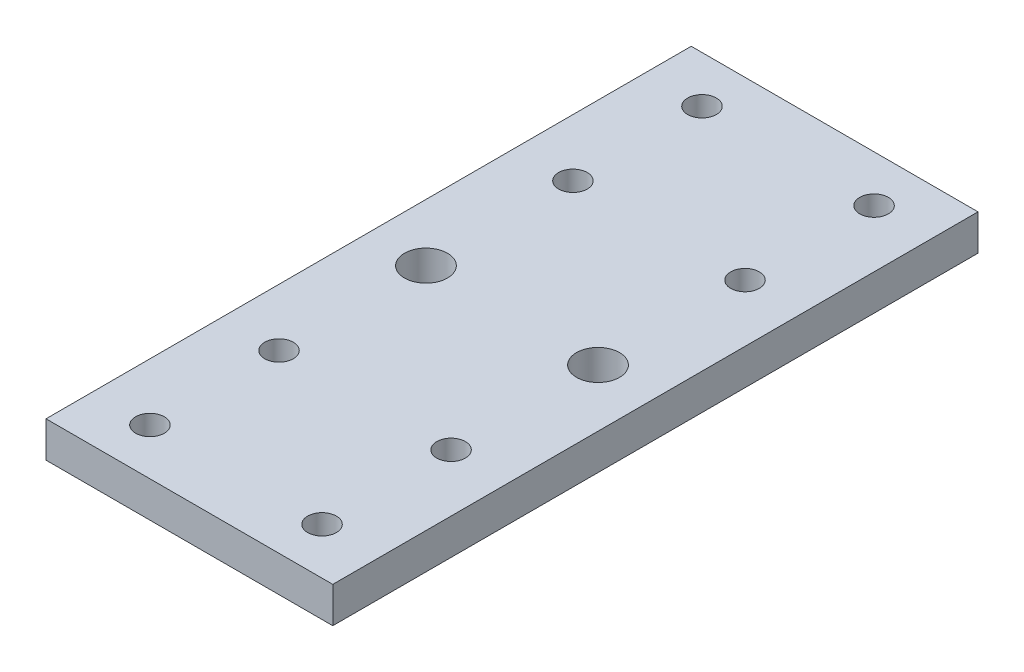
ISO-10303-21;
HEADER;
FILE_DESCRIPTION(('STEP AP214'),'2;1');
FILE_NAME('part.step','',(''),(''),'','','');
FILE_SCHEMA(('AUTOMOTIVE_DESIGN { 1 0 10303 214 1 1 1 1 }'));
ENDSEC;
DATA;
#1=APPLICATION_CONTEXT('core data for automotive mechanical design processes');
#2=APPLICATION_PROTOCOL_DEFINITION('international standard','automotive_design',2000,#1);
#3=PRODUCT_CONTEXT('',#1,'mechanical');
#4=PRODUCT('Part','Part','',(#3));
#5=PRODUCT_RELATED_PRODUCT_CATEGORY('part','',(#4));
#6=PRODUCT_DEFINITION_FORMATION('','',#4);
#7=PRODUCT_DEFINITION_CONTEXT('part definition',#1,'design');
#8=PRODUCT_DEFINITION('design','',#6,#7);
#9=PRODUCT_DEFINITION_SHAPE('','',#8);
#10=(LENGTH_UNIT() NAMED_UNIT(*) SI_UNIT(.MILLI.,.METRE.));
#11=(NAMED_UNIT(*) PLANE_ANGLE_UNIT() SI_UNIT($,.RADIAN.));
#12=(NAMED_UNIT(*) SI_UNIT($,.STERADIAN.) SOLID_ANGLE_UNIT());
#13=UNCERTAINTY_MEASURE_WITH_UNIT(LENGTH_MEASURE(1.E-05),#10,'distance_accuracy_value','');
#14=(GEOMETRIC_REPRESENTATION_CONTEXT(3) GLOBAL_UNCERTAINTY_ASSIGNED_CONTEXT((#13)) GLOBAL_UNIT_ASSIGNED_CONTEXT((#10,
#11,#12)) REPRESENTATION_CONTEXT('',''));
#15=CARTESIAN_POINT('',(0.,0.,0.));
#16=DIRECTION('',(0.,0.,1.));
#17=DIRECTION('',(1.,0.,0.));
#18=AXIS2_PLACEMENT_3D('',#15,#16,#17);
#19=CARTESIAN_POINT('',(0.,5.,0.));
#20=DIRECTION('',(0.,-1.,0.));
#21=DIRECTION('',(0.,0.,-1.));
#22=AXIS2_PLACEMENT_3D('',#19,#20,#21);
#23=PLANE('',#22);
#24=DIRECTION('',(0.,0.,-1.));
#25=VECTOR('',#24,1.);
#26=CARTESIAN_POINT('',(20.,5.,45.0000000000001));
#27=LINE('',#26,#25);
#28=CARTESIAN_POINT('',(20.,5.,45.0000000000001));
#29=VERTEX_POINT('',#28);
#30=CARTESIAN_POINT('',(20.,5.,-44.9999999999999));
#31=VERTEX_POINT('',#30);
#32=EDGE_CURVE('E85',#29,#31,#27,.T.);
#33=ORIENTED_EDGE('',*,*,#32,.T.);
#34=DIRECTION('',(-1.,0.,0.));
#35=VECTOR('',#34,1.);
#36=CARTESIAN_POINT('',(-20.,5.,-44.9999999999999));
#37=LINE('',#36,#35);
#38=CARTESIAN_POINT('',(-20.,5.,-44.9999999999999));
#39=VERTEX_POINT('',#38);
#40=EDGE_CURVE('E80',#31,#39,#37,.T.);
#41=ORIENTED_EDGE('',*,*,#40,.T.);
#42=DIRECTION('',(0.,0.,1.));
#43=VECTOR('',#42,1.);
#44=CARTESIAN_POINT('',(-20.,5.,45.0000000000001));
#45=LINE('',#44,#43);
#46=CARTESIAN_POINT('',(-20.,5.,45.0000000000001));
#47=VERTEX_POINT('',#46);
#48=EDGE_CURVE('E83',#39,#47,#45,.T.);
#49=ORIENTED_EDGE('',*,*,#48,.T.);
#50=DIRECTION('',(1.,0.,0.));
#51=VECTOR('',#50,1.);
#52=CARTESIAN_POINT('',(-20.,5.,45.0000000000001));
#53=LINE('',#52,#51);
#54=EDGE_CURVE('E50',#47,#29,#53,.T.);
#55=ORIENTED_EDGE('',*,*,#54,.T.);
#56=EDGE_LOOP('',(#33,#41,#49,#55));
#57=FACE_BOUND('',#56,.T.);
#58=CARTESIAN_POINT('',(-12.,5.,38.5000000000001));
#59=DIRECTION('',(0.,1.,0.));
#60=DIRECTION('',(0.,0.,1.));
#61=AXIS2_PLACEMENT_3D('',#58,#59,#60);
#62=CIRCLE('',#61,2.);
#63=CARTESIAN_POINT('',(-12.,5.,40.5000000000001));
#64=VERTEX_POINT('',#63);
#65=EDGE_CURVE('E100',#64,#64,#62,.T.);
#66=ORIENTED_EDGE('',*,*,#65,.F.);
#67=EDGE_LOOP('',(#66));
#68=FACE_BOUND('',#67,.T.);
#69=CARTESIAN_POINT('',(-12.,5.,20.5000000000001));
#70=DIRECTION('',(0.,1.,0.));
#71=DIRECTION('',(0.,0.,1.));
#72=AXIS2_PLACEMENT_3D('',#69,#70,#71);
#73=CIRCLE('',#72,2.);
#74=CARTESIAN_POINT('',(-12.,5.,22.5000000000001));
#75=VERTEX_POINT('',#74);
#76=EDGE_CURVE('E115',#75,#75,#73,.T.);
#77=ORIENTED_EDGE('',*,*,#76,.F.);
#78=EDGE_LOOP('',(#77));
#79=FACE_BOUND('',#78,.T.);
#80=CARTESIAN_POINT('',(-12.,5.,-20.4999999999999));
#81=DIRECTION('',(0.,1.,0.));
#82=DIRECTION('',(0.,0.,1.));
#83=AXIS2_PLACEMENT_3D('',#80,#81,#82);
#84=CIRCLE('',#83,2.);
#85=CARTESIAN_POINT('',(-12.,5.,-18.4999999999999));
#86=VERTEX_POINT('',#85);
#87=EDGE_CURVE('E121',#86,#86,#84,.T.);
#88=ORIENTED_EDGE('',*,*,#87,.F.);
#89=EDGE_LOOP('',(#88));
#90=FACE_BOUND('',#89,.T.);
#91=CARTESIAN_POINT('',(-12.,5.,-38.4999999999999));
#92=DIRECTION('',(0.,1.,0.));
#93=DIRECTION('',(0.,0.,1.));
#94=AXIS2_PLACEMENT_3D('',#91,#92,#93);
#95=CIRCLE('',#94,2.);
#96=CARTESIAN_POINT('',(-12.,5.,-36.4999999999999));
#97=VERTEX_POINT('',#96);
#98=EDGE_CURVE('E127',#97,#97,#95,.T.);
#99=ORIENTED_EDGE('',*,*,#98,.F.);
#100=EDGE_LOOP('',(#99));
#101=FACE_BOUND('',#100,.T.);
#102=CARTESIAN_POINT('',(12.,5.,-38.4999999999999));
#103=DIRECTION('',(0.,1.,0.));
#104=DIRECTION('',(0.,0.,1.));
#105=AXIS2_PLACEMENT_3D('',#102,#103,#104);
#106=CIRCLE('',#105,2.);
#107=CARTESIAN_POINT('',(12.,5.,-36.4999999999999));
#108=VERTEX_POINT('',#107);
#109=EDGE_CURVE('E133',#108,#108,#106,.T.);
#110=ORIENTED_EDGE('',*,*,#109,.F.);
#111=EDGE_LOOP('',(#110));
#112=FACE_BOUND('',#111,.T.);
#113=CARTESIAN_POINT('',(12.,5.,-20.4999999999999));
#114=DIRECTION('',(0.,1.,0.));
#115=DIRECTION('',(0.,0.,1.));
#116=AXIS2_PLACEMENT_3D('',#113,#114,#115);
#117=CIRCLE('',#116,2.);
#118=CARTESIAN_POINT('',(12.,5.,-18.4999999999999));
#119=VERTEX_POINT('',#118);
#120=EDGE_CURVE('E139',#119,#119,#117,.T.);
#121=ORIENTED_EDGE('',*,*,#120,.F.);
#122=EDGE_LOOP('',(#121));
#123=FACE_BOUND('',#122,.T.);
#124=CARTESIAN_POINT('',(12.,5.,20.5000000000001));
#125=DIRECTION('',(0.,1.,0.));
#126=DIRECTION('',(0.,0.,1.));
#127=AXIS2_PLACEMENT_3D('',#124,#125,#126);
#128=CIRCLE('',#127,2.);
#129=CARTESIAN_POINT('',(12.,5.,22.5000000000001));
#130=VERTEX_POINT('',#129);
#131=EDGE_CURVE('E145',#130,#130,#128,.T.);
#132=ORIENTED_EDGE('',*,*,#131,.F.);
#133=EDGE_LOOP('',(#132));
#134=FACE_BOUND('',#133,.T.);
#135=CARTESIAN_POINT('',(12.,5.,38.5000000000001));
#136=DIRECTION('',(0.,1.,0.));
#137=DIRECTION('',(0.,0.,1.));
#138=AXIS2_PLACEMENT_3D('',#135,#136,#137);
#139=CIRCLE('',#138,2.);
#140=CARTESIAN_POINT('',(12.,5.,40.5000000000001));
#141=VERTEX_POINT('',#140);
#142=EDGE_CURVE('E151',#141,#141,#139,.T.);
#143=ORIENTED_EDGE('',*,*,#142,.F.);
#144=EDGE_LOOP('',(#143));
#145=FACE_BOUND('',#144,.T.);
#146=CARTESIAN_POINT('',(-12.,5.,1.2490009027033E-13));
#147=DIRECTION('',(0.,1.,0.));
#148=DIRECTION('',(0.,0.,1.));
#149=AXIS2_PLACEMENT_3D('',#146,#147,#148);
#150=CIRCLE('',#149,3.);
#151=CARTESIAN_POINT('',(-12.,5.,3.00000000000012));
#152=VERTEX_POINT('',#151);
#153=EDGE_CURVE('E157',#152,#152,#150,.T.);
#154=ORIENTED_EDGE('',*,*,#153,.F.);
#155=EDGE_LOOP('',(#154));
#156=FACE_BOUND('',#155,.T.);
#157=CARTESIAN_POINT('',(12.,5.,1.2490009027033E-13));
#158=DIRECTION('',(0.,1.,0.));
#159=DIRECTION('',(0.,0.,-1.));
#160=AXIS2_PLACEMENT_3D('',#157,#158,#159);
#161=CIRCLE('',#160,3.);
#162=CARTESIAN_POINT('',(12.,5.,-2.99999999999987));
#163=VERTEX_POINT('',#162);
#164=EDGE_CURVE('E163',#163,#163,#161,.T.);
#165=ORIENTED_EDGE('',*,*,#164,.F.);
#166=EDGE_LOOP('',(#165));
#167=FACE_BOUND('',#166,.T.);
#168=ADVANCED_FACE('F33',(#57,#68,#79,#90,#101,#112,#123,#134,#145,#156,#167),#23,.F.);
#169=CARTESIAN_POINT('',(0.,0.,0.));
#170=DIRECTION('',(0.,-1.,0.));
#171=DIRECTION('',(0.,0.,-1.));
#172=AXIS2_PLACEMENT_3D('',#169,#170,#171);
#173=PLANE('',#172);
#174=CARTESIAN_POINT('',(-12.,0.,1.2490009027033E-13));
#175=DIRECTION('',(0.,1.,0.));
#176=DIRECTION('',(0.,0.,1.));
#177=AXIS2_PLACEMENT_3D('',#174,#175,#176);
#178=CIRCLE('',#177,3.);
#179=CARTESIAN_POINT('',(-12.,0.,3.00000000000012));
#180=VERTEX_POINT('',#179);
#181=EDGE_CURVE('E160',#180,#180,#178,.T.);
#182=ORIENTED_EDGE('',*,*,#181,.T.);
#183=EDGE_LOOP('',(#182));
#184=FACE_BOUND('',#183,.T.);
#185=CARTESIAN_POINT('',(12.,0.,20.5000000000001));
#186=DIRECTION('',(0.,1.,0.));
#187=DIRECTION('',(0.,0.,1.));
#188=AXIS2_PLACEMENT_3D('',#185,#186,#187);
#189=CIRCLE('',#188,2.);
#190=CARTESIAN_POINT('',(12.,0.,22.5000000000001));
#191=VERTEX_POINT('',#190);
#192=EDGE_CURVE('E148',#191,#191,#189,.T.);
#193=ORIENTED_EDGE('',*,*,#192,.T.);
#194=EDGE_LOOP('',(#193));
#195=FACE_BOUND('',#194,.T.);
#196=CARTESIAN_POINT('',(12.,0.,-38.4999999999999));
#197=DIRECTION('',(0.,1.,0.));
#198=DIRECTION('',(0.,0.,1.));
#199=AXIS2_PLACEMENT_3D('',#196,#197,#198);
#200=CIRCLE('',#199,2.);
#201=CARTESIAN_POINT('',(12.,0.,-36.4999999999999));
#202=VERTEX_POINT('',#201);
#203=EDGE_CURVE('E136',#202,#202,#200,.T.);
#204=ORIENTED_EDGE('',*,*,#203,.T.);
#205=EDGE_LOOP('',(#204));
#206=FACE_BOUND('',#205,.T.);
#207=CARTESIAN_POINT('',(-12.,0.,-20.4999999999999));
#208=DIRECTION('',(0.,1.,0.));
#209=DIRECTION('',(0.,0.,1.));
#210=AXIS2_PLACEMENT_3D('',#207,#208,#209);
#211=CIRCLE('',#210,2.);
#212=CARTESIAN_POINT('',(-12.,0.,-18.4999999999999));
#213=VERTEX_POINT('',#212);
#214=EDGE_CURVE('E124',#213,#213,#211,.T.);
#215=ORIENTED_EDGE('',*,*,#214,.T.);
#216=EDGE_LOOP('',(#215));
#217=FACE_BOUND('',#216,.T.);
#218=CARTESIAN_POINT('',(-12.,0.,38.5000000000001));
#219=DIRECTION('',(0.,1.,0.));
#220=DIRECTION('',(0.,0.,1.));
#221=AXIS2_PLACEMENT_3D('',#218,#219,#220);
#222=CIRCLE('',#221,2.);
#223=CARTESIAN_POINT('',(-12.,0.,40.5000000000001));
#224=VERTEX_POINT('',#223);
#225=EDGE_CURVE('E112',#224,#224,#222,.T.);
#226=ORIENTED_EDGE('',*,*,#225,.T.);
#227=EDGE_LOOP('',(#226));
#228=FACE_BOUND('',#227,.T.);
#229=DIRECTION('',(0.,0.,-1.));
#230=VECTOR('',#229,1.);
#231=CARTESIAN_POINT('',(20.,0.,45.0000000000001));
#232=LINE('',#231,#230);
#233=CARTESIAN_POINT('',(20.,0.,45.0000000000001));
#234=VERTEX_POINT('',#233);
#235=CARTESIAN_POINT('',(20.,0.,-44.9999999999999));
#236=VERTEX_POINT('',#235);
#237=EDGE_CURVE('E97',#234,#236,#232,.T.);
#238=ORIENTED_EDGE('',*,*,#237,.F.);
#239=DIRECTION('',(1.,0.,0.));
#240=VECTOR('',#239,1.);
#241=CARTESIAN_POINT('',(-20.,0.,45.0000000000001));
#242=LINE('',#241,#240);
#243=CARTESIAN_POINT('',(-20.,0.,45.0000000000001));
#244=VERTEX_POINT('',#243);
#245=EDGE_CURVE('E73',#244,#234,#242,.T.);
#246=ORIENTED_EDGE('',*,*,#245,.F.);
#247=DIRECTION('',(0.,0.,1.));
#248=VECTOR('',#247,1.);
#249=CARTESIAN_POINT('',(-20.,0.,45.0000000000001));
#250=LINE('',#249,#248);
#251=CARTESIAN_POINT('',(-20.,0.,-44.9999999999999));
#252=VERTEX_POINT('',#251);
#253=EDGE_CURVE('E67',#252,#244,#250,.T.);
#254=ORIENTED_EDGE('',*,*,#253,.F.);
#255=DIRECTION('',(-1.,0.,0.));
#256=VECTOR('',#255,1.);
#257=CARTESIAN_POINT('',(-20.,0.,-44.9999999999999));
#258=LINE('',#257,#256);
#259=EDGE_CURVE('E89',#236,#252,#258,.T.);
#260=ORIENTED_EDGE('',*,*,#259,.F.);
#261=EDGE_LOOP('',(#238,#246,#254,#260));
#262=FACE_BOUND('',#261,.T.);
#263=CARTESIAN_POINT('',(-12.,0.,20.5000000000001));
#264=DIRECTION('',(0.,1.,0.));
#265=DIRECTION('',(0.,0.,1.));
#266=AXIS2_PLACEMENT_3D('',#263,#264,#265);
#267=CIRCLE('',#266,2.);
#268=CARTESIAN_POINT('',(-12.,0.,22.5000000000001));
#269=VERTEX_POINT('',#268);
#270=EDGE_CURVE('E118',#269,#269,#267,.T.);
#271=ORIENTED_EDGE('',*,*,#270,.T.);
#272=EDGE_LOOP('',(#271));
#273=FACE_BOUND('',#272,.T.);
#274=CARTESIAN_POINT('',(-12.,0.,-38.4999999999999));
#275=DIRECTION('',(0.,1.,0.));
#276=DIRECTION('',(0.,0.,1.));
#277=AXIS2_PLACEMENT_3D('',#274,#275,#276);
#278=CIRCLE('',#277,2.);
#279=CARTESIAN_POINT('',(-12.,0.,-36.4999999999999));
#280=VERTEX_POINT('',#279);
#281=EDGE_CURVE('E130',#280,#280,#278,.T.);
#282=ORIENTED_EDGE('',*,*,#281,.T.);
#283=EDGE_LOOP('',(#282));
#284=FACE_BOUND('',#283,.T.);
#285=CARTESIAN_POINT('',(12.,0.,-20.4999999999999));
#286=DIRECTION('',(0.,1.,0.));
#287=DIRECTION('',(0.,0.,1.));
#288=AXIS2_PLACEMENT_3D('',#285,#286,#287);
#289=CIRCLE('',#288,2.);
#290=CARTESIAN_POINT('',(12.,0.,-18.4999999999999));
#291=VERTEX_POINT('',#290);
#292=EDGE_CURVE('E142',#291,#291,#289,.T.);
#293=ORIENTED_EDGE('',*,*,#292,.T.);
#294=EDGE_LOOP('',(#293));
#295=FACE_BOUND('',#294,.T.);
#296=CARTESIAN_POINT('',(12.,0.,38.5000000000001));
#297=DIRECTION('',(0.,1.,0.));
#298=DIRECTION('',(0.,0.,1.));
#299=AXIS2_PLACEMENT_3D('',#296,#297,#298);
#300=CIRCLE('',#299,2.);
#301=CARTESIAN_POINT('',(12.,0.,40.5000000000001));
#302=VERTEX_POINT('',#301);
#303=EDGE_CURVE('E154',#302,#302,#300,.T.);
#304=ORIENTED_EDGE('',*,*,#303,.T.);
#305=EDGE_LOOP('',(#304));
#306=FACE_BOUND('',#305,.T.);
#307=CARTESIAN_POINT('',(12.,0.,1.2490009027033E-13));
#308=DIRECTION('',(0.,1.,0.));
#309=DIRECTION('',(0.,0.,-1.));
#310=AXIS2_PLACEMENT_3D('',#307,#308,#309);
#311=CIRCLE('',#310,3.);
#312=CARTESIAN_POINT('',(12.,0.,-2.99999999999987));
#313=VERTEX_POINT('',#312);
#314=EDGE_CURVE('E166',#313,#313,#311,.T.);
#315=ORIENTED_EDGE('',*,*,#314,.T.);
#316=EDGE_LOOP('',(#315));
#317=FACE_BOUND('',#316,.T.);
#318=ADVANCED_FACE('F108',(#184,#195,#206,#217,#228,#262,#273,#284,#295,#306,#317),#173,.T.);
#319=CARTESIAN_POINT('',(20.,5.,45.0000000000001));
#320=DIRECTION('',(-1.,0.,0.));
#321=DIRECTION('',(0.,0.,1.));
#322=AXIS2_PLACEMENT_3D('',#319,#320,#321);
#323=PLANE('',#322);
#324=ORIENTED_EDGE('',*,*,#237,.T.);
#325=DIRECTION('',(0.,-1.,0.));
#326=VECTOR('',#325,1.);
#327=CARTESIAN_POINT('',(20.,5.,-44.9999999999999));
#328=LINE('',#327,#326);
#329=EDGE_CURVE('E11',#31,#236,#328,.T.);
#330=ORIENTED_EDGE('',*,*,#329,.F.);
#331=ORIENTED_EDGE('',*,*,#32,.F.);
#332=DIRECTION('',(0.,-1.,0.));
#333=VECTOR('',#332,1.);
#334=CARTESIAN_POINT('',(20.,5.,45.0000000000001));
#335=LINE('',#334,#333);
#336=EDGE_CURVE('E93',#29,#234,#335,.T.);
#337=ORIENTED_EDGE('',*,*,#336,.T.);
#338=EDGE_LOOP('',(#324,#330,#331,#337));
#339=FACE_BOUND('',#338,.T.);
#340=ADVANCED_FACE('F35',(#339),#323,.F.);
#341=CARTESIAN_POINT('',(-20.,5.,-44.9999999999999));
#342=DIRECTION('',(0.,0.,1.));
#343=DIRECTION('',(1.,0.,0.));
#344=AXIS2_PLACEMENT_3D('',#341,#342,#343);
#345=PLANE('',#344);
#346=ORIENTED_EDGE('',*,*,#259,.T.);
#347=DIRECTION('',(0.,-1.,0.));
#348=VECTOR('',#347,1.);
#349=CARTESIAN_POINT('',(-20.,5.,-44.9999999999999));
#350=LINE('',#349,#348);
#351=EDGE_CURVE('E42',#39,#252,#350,.T.);
#352=ORIENTED_EDGE('',*,*,#351,.F.);
#353=ORIENTED_EDGE('',*,*,#40,.F.);
#354=ORIENTED_EDGE('',*,*,#329,.T.);
#355=EDGE_LOOP('',(#346,#352,#353,#354));
#356=FACE_BOUND('',#355,.T.);
#357=ADVANCED_FACE('F88',(#356),#345,.F.);
#358=CARTESIAN_POINT('',(-20.,5.,45.0000000000001));
#359=DIRECTION('',(1.,0.,0.));
#360=DIRECTION('',(0.,0.,-1.));
#361=AXIS2_PLACEMENT_3D('',#358,#359,#360);
#362=PLANE('',#361);
#363=ORIENTED_EDGE('',*,*,#253,.T.);
#364=DIRECTION('',(0.,-1.,0.));
#365=VECTOR('',#364,1.);
#366=CARTESIAN_POINT('',(-20.,5.,45.0000000000001));
#367=LINE('',#366,#365);
#368=EDGE_CURVE('E90',#47,#244,#367,.T.);
#369=ORIENTED_EDGE('',*,*,#368,.F.);
#370=ORIENTED_EDGE('',*,*,#48,.F.);
#371=ORIENTED_EDGE('',*,*,#351,.T.);
#372=EDGE_LOOP('',(#363,#369,#370,#371));
#373=FACE_BOUND('',#372,.T.);
#374=ADVANCED_FACE('F91',(#373),#362,.F.);
#375=CARTESIAN_POINT('',(-20.,5.,45.0000000000001));
#376=DIRECTION('',(0.,0.,-1.));
#377=DIRECTION('',(-1.,0.,0.));
#378=AXIS2_PLACEMENT_3D('',#375,#376,#377);
#379=PLANE('',#378);
#380=ORIENTED_EDGE('',*,*,#245,.T.);
#381=ORIENTED_EDGE('',*,*,#336,.F.);
#382=ORIENTED_EDGE('',*,*,#54,.F.);
#383=ORIENTED_EDGE('',*,*,#368,.T.);
#384=EDGE_LOOP('',(#380,#381,#382,#383));
#385=FACE_BOUND('',#384,.T.);
#386=ADVANCED_FACE('F105',(#385),#379,.F.);
#387=CARTESIAN_POINT('',(-12.,5.,38.5000000000001));
#388=DIRECTION('',(0.,-1.,0.));
#389=DIRECTION('',(0.,0.,-1.));
#390=AXIS2_PLACEMENT_3D('',#387,#388,#389);
#391=CYLINDRICAL_SURFACE('',#390,2.);
#392=ORIENTED_EDGE('',*,*,#65,.T.);
#393=EDGE_LOOP('',(#392));
#394=FACE_BOUND('',#393,.T.);
#395=ORIENTED_EDGE('',*,*,#225,.F.);
#396=EDGE_LOOP('',(#395));
#397=FACE_BOUND('',#396,.T.);
#398=ADVANCED_FACE('F183',(#394,#397),#391,.F.);
#399=CARTESIAN_POINT('',(-12.,5.,20.5000000000001));
#400=DIRECTION('',(0.,-1.,0.));
#401=DIRECTION('',(0.,0.,-1.));
#402=AXIS2_PLACEMENT_3D('',#399,#400,#401);
#403=CYLINDRICAL_SURFACE('',#402,2.);
#404=ORIENTED_EDGE('',*,*,#76,.T.);
#405=EDGE_LOOP('',(#404));
#406=FACE_BOUND('',#405,.T.);
#407=ORIENTED_EDGE('',*,*,#270,.F.);
#408=EDGE_LOOP('',(#407));
#409=FACE_BOUND('',#408,.T.);
#410=ADVANCED_FACE('F229',(#406,#409),#403,.F.);
#411=CARTESIAN_POINT('',(-12.,5.,-20.4999999999999));
#412=DIRECTION('',(0.,-1.,0.));
#413=DIRECTION('',(0.,0.,-1.));
#414=AXIS2_PLACEMENT_3D('',#411,#412,#413);
#415=CYLINDRICAL_SURFACE('',#414,2.);
#416=ORIENTED_EDGE('',*,*,#87,.T.);
#417=EDGE_LOOP('',(#416));
#418=FACE_BOUND('',#417,.T.);
#419=ORIENTED_EDGE('',*,*,#214,.F.);
#420=EDGE_LOOP('',(#419));
#421=FACE_BOUND('',#420,.T.);
#422=ADVANCED_FACE('F237',(#418,#421),#415,.F.);
#423=CARTESIAN_POINT('',(-12.,5.,-38.4999999999999));
#424=DIRECTION('',(0.,-1.,0.));
#425=DIRECTION('',(0.,0.,-1.));
#426=AXIS2_PLACEMENT_3D('',#423,#424,#425);
#427=CYLINDRICAL_SURFACE('',#426,2.);
#428=ORIENTED_EDGE('',*,*,#98,.T.);
#429=EDGE_LOOP('',(#428));
#430=FACE_BOUND('',#429,.T.);
#431=ORIENTED_EDGE('',*,*,#281,.F.);
#432=EDGE_LOOP('',(#431));
#433=FACE_BOUND('',#432,.T.);
#434=ADVANCED_FACE('F245',(#430,#433),#427,.F.);
#435=CARTESIAN_POINT('',(12.,5.,-38.4999999999999));
#436=DIRECTION('',(0.,-1.,0.));
#437=DIRECTION('',(0.,0.,-1.));
#438=AXIS2_PLACEMENT_3D('',#435,#436,#437);
#439=CYLINDRICAL_SURFACE('',#438,2.);
#440=ORIENTED_EDGE('',*,*,#109,.T.);
#441=EDGE_LOOP('',(#440));
#442=FACE_BOUND('',#441,.T.);
#443=ORIENTED_EDGE('',*,*,#203,.F.);
#444=EDGE_LOOP('',(#443));
#445=FACE_BOUND('',#444,.T.);
#446=ADVANCED_FACE('F254',(#442,#445),#439,.F.);
#447=CARTESIAN_POINT('',(12.,5.,-20.4999999999999));
#448=DIRECTION('',(0.,-1.,0.));
#449=DIRECTION('',(0.,0.,-1.));
#450=AXIS2_PLACEMENT_3D('',#447,#448,#449);
#451=CYLINDRICAL_SURFACE('',#450,2.);
#452=ORIENTED_EDGE('',*,*,#120,.T.);
#453=EDGE_LOOP('',(#452));
#454=FACE_BOUND('',#453,.T.);
#455=ORIENTED_EDGE('',*,*,#292,.F.);
#456=EDGE_LOOP('',(#455));
#457=FACE_BOUND('',#456,.T.);
#458=ADVANCED_FACE('F263',(#454,#457),#451,.F.);
#459=CARTESIAN_POINT('',(12.,5.,20.5000000000001));
#460=DIRECTION('',(0.,-1.,0.));
#461=DIRECTION('',(0.,0.,-1.));
#462=AXIS2_PLACEMENT_3D('',#459,#460,#461);
#463=CYLINDRICAL_SURFACE('',#462,2.);
#464=ORIENTED_EDGE('',*,*,#131,.T.);
#465=EDGE_LOOP('',(#464));
#466=FACE_BOUND('',#465,.T.);
#467=ORIENTED_EDGE('',*,*,#192,.F.);
#468=EDGE_LOOP('',(#467));
#469=FACE_BOUND('',#468,.T.);
#470=ADVANCED_FACE('F272',(#466,#469),#463,.F.);
#471=CARTESIAN_POINT('',(12.,5.,38.5000000000001));
#472=DIRECTION('',(0.,-1.,0.));
#473=DIRECTION('',(0.,0.,-1.));
#474=AXIS2_PLACEMENT_3D('',#471,#472,#473);
#475=CYLINDRICAL_SURFACE('',#474,2.);
#476=ORIENTED_EDGE('',*,*,#142,.T.);
#477=EDGE_LOOP('',(#476));
#478=FACE_BOUND('',#477,.T.);
#479=ORIENTED_EDGE('',*,*,#303,.F.);
#480=EDGE_LOOP('',(#479));
#481=FACE_BOUND('',#480,.T.);
#482=ADVANCED_FACE('F281',(#478,#481),#475,.F.);
#483=CARTESIAN_POINT('',(-12.,5.,1.2490009027033E-13));
#484=DIRECTION('',(0.,-1.,0.));
#485=DIRECTION('',(0.,0.,-1.));
#486=AXIS2_PLACEMENT_3D('',#483,#484,#485);
#487=CYLINDRICAL_SURFACE('',#486,3.);
#488=ORIENTED_EDGE('',*,*,#153,.T.);
#489=EDGE_LOOP('',(#488));
#490=FACE_BOUND('',#489,.T.);
#491=ORIENTED_EDGE('',*,*,#181,.F.);
#492=EDGE_LOOP('',(#491));
#493=FACE_BOUND('',#492,.T.);
#494=ADVANCED_FACE('F290',(#490,#493),#487,.F.);
#495=CARTESIAN_POINT('',(12.,5.,1.2490009027033E-13));
#496=DIRECTION('',(0.,-1.,0.));
#497=DIRECTION('',(0.,0.,-1.));
#498=AXIS2_PLACEMENT_3D('',#495,#496,#497);
#499=CYLINDRICAL_SURFACE('',#498,3.);
#500=ORIENTED_EDGE('',*,*,#164,.T.);
#501=EDGE_LOOP('',(#500));
#502=FACE_BOUND('',#501,.T.);
#503=ORIENTED_EDGE('',*,*,#314,.F.);
#504=EDGE_LOOP('',(#503));
#505=FACE_BOUND('',#504,.T.);
#506=ADVANCED_FACE('F172',(#502,#505),#499,.F.);
#507=CLOSED_SHELL('',(#168,#318,#340,#357,#374,#386,#398,#410,#422,#434,#446,#458,#470,#482,
#494,#506));
#508=MANIFOLD_SOLID_BREP('B2',#507);
#509=ADVANCED_BREP_SHAPE_REPRESENTATION('',(#18,#508),#14);
#510=SHAPE_DEFINITION_REPRESENTATION(#9,#509);
ENDSEC;
END-ISO-10303-21;
